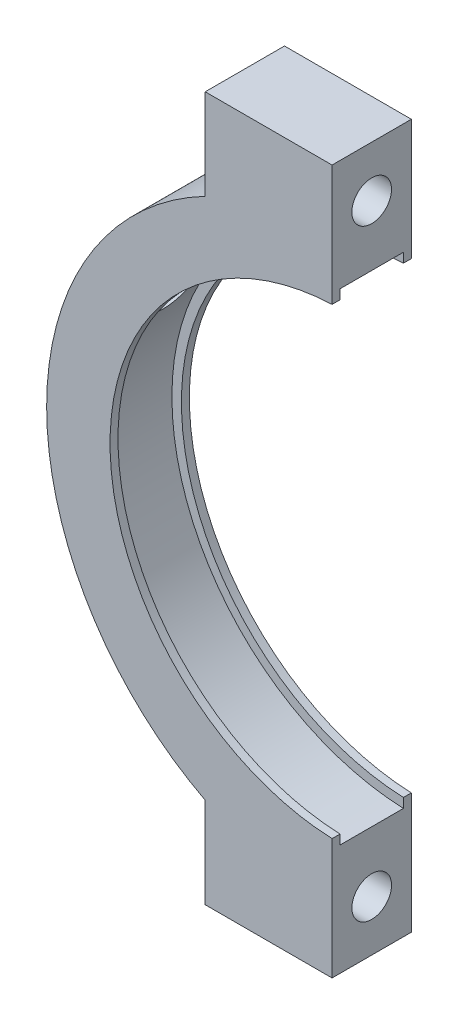
ISO-10303-21;
HEADER;
FILE_DESCRIPTION(('STEP AP214'),'2;1');
FILE_NAME('part.step','',(''),(''),'','','');
FILE_SCHEMA(('AUTOMOTIVE_DESIGN { 1 0 10303 214 1 1 1 1 }'));
ENDSEC;
DATA;
#1=APPLICATION_CONTEXT('core data for automotive mechanical design processes');
#2=APPLICATION_PROTOCOL_DEFINITION('international standard','automotive_design',2000,#1);
#3=PRODUCT_CONTEXT('',#1,'mechanical');
#4=PRODUCT('Part','Part','',(#3));
#5=PRODUCT_RELATED_PRODUCT_CATEGORY('part','',(#4));
#6=PRODUCT_DEFINITION_FORMATION('','',#4);
#7=PRODUCT_DEFINITION_CONTEXT('part definition',#1,'design');
#8=PRODUCT_DEFINITION('design','',#6,#7);
#9=PRODUCT_DEFINITION_SHAPE('','',#8);
#10=(LENGTH_UNIT() NAMED_UNIT(*) SI_UNIT(.MILLI.,.METRE.));
#11=(NAMED_UNIT(*) PLANE_ANGLE_UNIT() SI_UNIT($,.RADIAN.));
#12=(NAMED_UNIT(*) SI_UNIT($,.STERADIAN.) SOLID_ANGLE_UNIT());
#13=UNCERTAINTY_MEASURE_WITH_UNIT(LENGTH_MEASURE(1.E-05),#10,'distance_accuracy_value','');
#14=(GEOMETRIC_REPRESENTATION_CONTEXT(3) GLOBAL_UNCERTAINTY_ASSIGNED_CONTEXT((#13)) GLOBAL_UNIT_ASSIGNED_CONTEXT((#10,
#11,#12)) REPRESENTATION_CONTEXT('',''));
#15=CARTESIAN_POINT('',(0.,0.,0.));
#16=DIRECTION('',(0.,0.,1.));
#17=DIRECTION('',(1.,0.,0.));
#18=AXIS2_PLACEMENT_3D('',#15,#16,#17);
#19=CARTESIAN_POINT('',(0.,0.,12.5));
#20=DIRECTION('',(0.,0.,-1.));
#21=DIRECTION('',(-1.,0.,0.));
#22=AXIS2_PLACEMENT_3D('',#19,#20,#21);
#23=CYLINDRICAL_SURFACE('',#22,76.);
#24=CARTESIAN_POINT('',(-68.5692997524356,32.7757704937754,0.));
#25=CARTESIAN_POINT('',(-68.5693002058538,32.7757690854834,-0.165493667479842));
#26=CARTESIAN_POINT('',(-68.5662873724525,32.7820747233003,-0.33096462819236));
#27=CARTESIAN_POINT('',(-68.5542474318624,32.807245558167,-0.660781878736066));
#28=CARTESIAN_POINT('',(-68.5452188265017,32.8261138838363,-0.825127878103317));
#29=CARTESIAN_POINT('',(-68.5211708228262,32.8762820275246,-1.15160530625675));
#30=CARTESIAN_POINT('',(-68.5061464250846,32.9075922197597,-1.31373476987005));
#31=CARTESIAN_POINT('',(-68.4701602448416,32.9824025523511,-1.63454844029392));
#32=CARTESIAN_POINT('',(-68.4491962906626,33.0259071512813,-1.79323136405701));
#33=CARTESIAN_POINT('',(-68.4014400412515,33.1247038478475,-2.10581793104487));
#34=CARTESIAN_POINT('',(-68.374653157051,33.179985001023,-2.25972586076757));
#35=CARTESIAN_POINT('',(-68.3153388232892,33.3019380488995,-2.56188426429269));
#36=CARTESIAN_POINT('',(-68.2828092602809,33.3686141369272,-2.71013263072218));
#37=CARTESIAN_POINT('',(-68.2121740578346,33.5127698873989,-2.99978046034227));
#38=CARTESIAN_POINT('',(-68.1740717203821,33.5902431510185,-3.14118391370381));
#39=CARTESIAN_POINT('',(-68.0924263358897,33.7554434776051,-3.4162923144143));
#40=CARTESIAN_POINT('',(-68.0488812814241,33.8431743230794,-3.54999439456419));
#41=CARTESIAN_POINT('',(-67.9564813123334,34.0283318172424,-3.80891378375593));
#42=CARTESIAN_POINT('',(-67.9076179041945,34.1257739534888,-3.93411698653914));
#43=CARTESIAN_POINT('',(-67.8048475626829,34.3295159582644,-4.17496251412808));
#44=CARTESIAN_POINT('',(-67.7509387724542,34.4358190863248,-4.29060128920192));
#45=CARTESIAN_POINT('',(-67.6383727016015,34.6563971082992,-4.51141380456402));
#46=CARTESIAN_POINT('',(-67.5797169718978,34.7706693968552,-4.6165909380457));
#47=CARTESIAN_POINT('',(-67.4579163135299,35.0063869803777,-4.81581567689755));
#48=CARTESIAN_POINT('',(-67.3947697360081,35.1278349071503,-4.90985916031907));
#49=CARTESIAN_POINT('',(-67.2642827543562,35.3770555785603,-5.08618154838043));
#50=CARTESIAN_POINT('',(-67.1969386860885,35.5048338286223,-5.16844996169271));
#51=CARTESIAN_POINT('',(-67.058457995789,35.7656962788402,-5.32056306629331));
#52=CARTESIAN_POINT('',(-66.9873199800277,35.8987824242925,-5.39040315052959));
#53=CARTESIAN_POINT('',(-66.841708168528,36.1691801170528,-5.51709643666651));
#54=CARTESIAN_POINT('',(-66.7672356566567,36.3064900318346,-5.5739545863827));
#55=CARTESIAN_POINT('',(-66.615385399669,36.5843626193006,-5.67432455388897));
#56=CARTESIAN_POINT('',(-66.5380065947611,36.724926471235,-5.71783144900137));
#57=CARTESIAN_POINT('',(-66.3026078390417,37.1492676817676,-5.82759802324825));
#58=CARTESIAN_POINT('',(-66.1408676891957,37.436546798973,-5.87350147852735));
#59=CARTESIAN_POINT('',(-65.8121788387295,38.0114055389987,-5.90930967715707));
#60=CARTESIAN_POINT('',(-65.6452302235067,38.2989851568175,-5.89921533816361));
#61=CARTESIAN_POINT('',(-65.3112014687383,38.8658578687487,-5.82347857635176));
#62=CARTESIAN_POINT('',(-65.1441223876118,39.1451674820666,-5.75795588502686));
#63=CARTESIAN_POINT('',(-64.8145978240686,39.6883979641118,-5.57338897383246));
#64=CARTESIAN_POINT('',(-64.6521523807803,39.9523187029079,-5.45434430214119));
#65=CARTESIAN_POINT('',(-64.3369297240062,40.457983485722,-5.16598374869025));
#66=CARTESIAN_POINT('',(-64.1841630765392,40.6997034189798,-4.99661403811585));
#67=CARTESIAN_POINT('',(-63.8936119101659,41.1543346885563,-4.6124488956435));
#68=CARTESIAN_POINT('',(-63.7558276544059,41.3672455188966,-4.39765266608273));
#69=CARTESIAN_POINT('',(-63.4997039829514,41.7593426990355,-3.92805670847477));
#70=CARTESIAN_POINT('',(-63.3814168204587,41.9384386039561,-3.67315294815839));
#71=CARTESIAN_POINT('',(-63.1690195289451,42.2576839901445,-3.13094073589916));
#72=CARTESIAN_POINT('',(-63.0749094162459,42.3978334451201,-2.84363226208045));
#73=CARTESIAN_POINT('',(-62.9143775580726,42.6356868143888,-2.24469503175817));
#74=CARTESIAN_POINT('',(-62.8479586098073,42.7333864406763,-1.93306382207886));
#75=CARTESIAN_POINT('',(-62.7453737755502,42.8838715188559,-1.29436078544765));
#76=CARTESIAN_POINT('',(-62.7092073385653,42.9366577887612,-0.967289239827253));
#77=CARTESIAN_POINT('',(-62.6685912872453,42.9959181741153,-0.307903042890027));
#78=CARTESIAN_POINT('',(-62.6640592027082,43.00251271076,0.0243957100584196));
#79=CARTESIAN_POINT('',(-62.6866705314482,42.9695441176282,0.685605959048097));
#80=CARTESIAN_POINT('',(-62.7138136888614,42.9299813606976,1.01451748242879));
#81=CARTESIAN_POINT('',(-62.7986636007554,42.8057640713446,1.65920081071759));
#82=CARTESIAN_POINT('',(-62.8563323037672,42.7211656771272,1.97498844774646));
#83=CARTESIAN_POINT('',(-63.0000005100945,42.5090137828762,2.5849498462903));
#84=CARTESIAN_POINT('',(-63.08600040875,42.3814596834282,2.87912330612595));
#85=CARTESIAN_POINT('',(-63.2833166769588,42.0862601800627,3.43817257365719));
#86=CARTESIAN_POINT('',(-63.3946849331412,41.9185325714007,3.70298665803465));
#87=CARTESIAN_POINT('',(-63.6385768920037,41.5473310504592,4.19517674506254));
#88=CARTESIAN_POINT('',(-63.7711009111098,41.3438566035109,4.4225521876411));
#89=CARTESIAN_POINT('',(-64.0529318964062,40.905864591287,4.83390626296211));
#90=CARTESIAN_POINT('',(-64.2022743626312,40.6712811693652,5.01779046135102));
#91=CARTESIAN_POINT('',(-64.5124178215415,40.1775160756981,5.33629311483774));
#92=CARTESIAN_POINT('',(-64.6732187127851,39.9183346217129,5.47091200601786));
#93=CARTESIAN_POINT('',(-65.0007997308949,39.3826675204967,5.68690632292662));
#94=CARTESIAN_POINT('',(-65.1675730383364,39.106201356096,5.76834055226198));
#95=CARTESIAN_POINT('',(-65.502177030343,38.5431155565696,5.87582223920589));
#96=CARTESIAN_POINT('',(-65.6700076977566,38.2564960857934,5.90187059291852));
#97=CARTESIAN_POINT('',(-65.9183998991286,37.8258145653503,5.89890576963857));
#98=CARTESIAN_POINT('',(-66.0005755607502,37.6822409154132,5.89093382381589));
#99=CARTESIAN_POINT('',(-66.1633663824283,37.3956682863583,5.86112528533816));
#100=CARTESIAN_POINT('',(-66.2439821090117,37.2526691141454,5.83929382731235));
#101=CARTESIAN_POINT('',(-66.4031408674464,36.968222594981,5.78190720587489));
#102=CARTESIAN_POINT('',(-66.4816831246207,36.8267758392503,5.74634698861476));
#103=CARTESIAN_POINT('',(-66.6361359385555,36.5465588803305,5.6617784536991));
#104=CARTESIAN_POINT('',(-66.7120474500252,36.4077877144438,5.61277507342708));
#105=CARTESIAN_POINT('',(-66.8608206345543,36.1338479968174,5.50164766509379));
#106=CARTESIAN_POINT('',(-66.9336813108022,35.9986806277204,5.43951938815141));
#107=CARTESIAN_POINT('',(-67.075868875599,35.7330449812473,5.30262152976062));
#108=CARTESIAN_POINT('',(-67.1451970492787,35.6025750000951,5.22785658890941));
#109=CARTESIAN_POINT('',(-67.2799786150256,35.3472111002194,5.06617339984334));
#110=CARTESIAN_POINT('',(-67.3454306632011,35.2223191190913,4.97925097121455));
#111=CARTESIAN_POINT('',(-67.4720564335756,34.9791422112201,4.79392223201629));
#112=CARTESIAN_POINT('',(-67.5332317093253,34.8608548884908,4.69552012650474));
#113=CARTESIAN_POINT('',(-67.6511832625119,34.6314033053599,4.48760182204019));
#114=CARTESIAN_POINT('',(-67.707946402383,34.5202604765047,4.37805451718884));
#115=CARTESIAN_POINT('',(-67.8165757528243,34.3063615138502,4.14889866933275));
#116=CARTESIAN_POINT('',(-67.868443750704,34.2036023208982,4.02929382892359));
#117=CARTESIAN_POINT('',(-67.9670894842171,34.007158639553,3.78075531824006));
#118=CARTESIAN_POINT('',(-68.0138640851957,33.913479743345,3.65181598354101));
#119=CARTESIAN_POINT('',(-68.1020556135324,33.7360317446918,3.38563242879528));
#120=CARTESIAN_POINT('',(-68.1434745116022,33.6522589981055,3.24839129096373));
#121=CARTESIAN_POINT('',(-68.2208710923037,33.4950808454558,2.96623927696069));
#122=CARTESIAN_POINT('',(-68.2568374305316,33.42169707475,2.82131323450793));
#123=CARTESIAN_POINT('',(-68.3230595900064,33.2861115375904,2.52513453866452));
#124=CARTESIAN_POINT('',(-68.3533174995768,33.2239056822997,2.37388422372653));
#125=CARTESIAN_POINT('',(-68.4079892967638,33.1111903329462,2.06620912366223));
#126=CARTESIAN_POINT('',(-68.4324081306382,33.0606709405184,1.90978884677084));
#127=CARTESIAN_POINT('',(-68.475328582494,32.9716819487474,1.59282030448826));
#128=CARTESIAN_POINT('',(-68.4938316944632,32.9332093071044,1.43227309241835));
#129=CARTESIAN_POINT('',(-68.5292832266452,32.8593898067337,1.06186392489873));
#130=CARTESIAN_POINT('',(-68.5442825164301,32.8280652127732,0.850998628493258));
#131=CARTESIAN_POINT('',(-68.5642904756897,32.7862564877782,0.426742971282811));
#132=CARTESIAN_POINT('',(-68.5692991678939,32.7757723093299,0.213352616223684));
#133=CARTESIAN_POINT('',(-68.5692997524356,32.7757704937754,0.));
#134=B_SPLINE_CURVE_WITH_KNOTS('',3,(#24,#25,#26,#27,#28,#29,#30,#31,#32,#33,#34,#35,#36,#37,
#38,#39,#40,#41,#42,#43,#44,#45,#46,#47,#48,#49,#50,#51,#52,#53,#54,#55,#56,#57,#58,#59,#60,#61,
#62,#63,#64,#65,#66,#67,#68,#69,#70,#71,#72,#73,#74,#75,#76,#77,#78,#79,#80,#81,#82,#83,#84,#85,
#86,#87,#88,#89,#90,#91,#92,#93,#94,#95,#96,#97,#98,#99,#100,#101,#102,#103,#104,#105,#106,#107,
#108,#109,#110,#111,#112,#113,#114,#115,#116,#117,#118,#119,#120,#121,#122,#123,#124,#125,#126,
#127,#128,#129,#130,#131,#132,#133),.UNSPECIFIED.,.T.,.F.,(4,2,2,2,2,2,2,2,2,2,2,2,2,2,2,2,2,2,
2,2,2,2,2,2,2,2,2,2,2,2,2,2,2,2,2,2,2,2,2,2,2,2,2,2,2,2,2,2,2,2,2,2,2,2,4),(0.,
0.496294512562512,0.992712668868089,1.48954561759398,1.98656045810053,2.483115400713,
2.97985347017489,3.47629839545591,3.97292696678587,4.47036063559986,4.96797810066379,
5.46543363547082,5.9630727682891,6.46115256275286,6.95941660733734,7.45749042994399,
7.95574767495123,8.94916404498434,9.94256413559565,10.933823833307,11.9250918991902,
12.917424088529,13.9097737040812,14.9047410821773,15.8997091319626,16.8947776635976,
17.889828071523,18.8822834283691,19.8747307684882,20.865943881602,21.8571708269206,
22.850443656758,23.8437313443361,24.8391563949528,25.8345726341405,26.8288864200178,
27.8231841184827,28.3195594809652,28.8157510550687,29.3121254622869,29.8083178054168,
30.3046710261448,30.8008423641727,31.2971847346051,31.7933458600907,32.2909318606319,
32.7883354744557,33.2860434981042,33.7835678582528,34.2821135486519,34.780476500126,
35.2784157828188,35.7762292137635,36.416048097383,37.0558655253554),.UNSPECIFIED.);
#135=CARTESIAN_POINT('',(-68.5692997524356,32.7757704937754,0.));
#136=VERTEX_POINT('',#135);
#137=EDGE_CURVE('E324',#136,#136,#134,.T.);
#138=ORIENTED_EDGE('',*,*,#137,.F.);
#139=EDGE_LOOP('',(#138));
#140=FACE_BOUND('',#139,.T.);
#141=DIRECTION('',(0.,0.,-1.));
#142=VECTOR('',#141,1.);
#143=CARTESIAN_POINT('',(-3.,-75.9407663906548,12.5));
#144=LINE('',#143,#142);
#145=CARTESIAN_POINT('',(-3.,-75.9407663906548,10.));
#146=VERTEX_POINT('',#145);
#147=CARTESIAN_POINT('',(-3.,-75.9407663906548,-10.));
#148=VERTEX_POINT('',#147);
#149=EDGE_CURVE('E257',#146,#148,#144,.T.);
#150=ORIENTED_EDGE('',*,*,#149,.T.);
#151=CARTESIAN_POINT('',(0.,0.,-10.));
#152=DIRECTION('',(0.,0.,1.));
#153=DIRECTION('',(1.,0.,0.));
#154=AXIS2_PLACEMENT_3D('',#151,#152,#153);
#155=CIRCLE('',#154,76.);
#156=CARTESIAN_POINT('',(-3.,75.9407663906548,-10.));
#157=VERTEX_POINT('',#156);
#158=EDGE_CURVE('E164',#157,#148,#155,.T.);
#159=ORIENTED_EDGE('',*,*,#158,.F.);
#160=DIRECTION('',(0.,0.,-1.));
#161=VECTOR('',#160,1.);
#162=CARTESIAN_POINT('',(-3.,75.9407663906548,12.5));
#163=LINE('',#162,#161);
#164=CARTESIAN_POINT('',(-3.,75.9407663906548,10.));
#165=VERTEX_POINT('',#164);
#166=EDGE_CURVE('E73',#165,#157,#163,.T.);
#167=ORIENTED_EDGE('',*,*,#166,.F.);
#168=CARTESIAN_POINT('',(0.,0.,10.));
#169=DIRECTION('',(0.,0.,1.));
#170=DIRECTION('',(1.,0.,0.));
#171=AXIS2_PLACEMENT_3D('',#168,#169,#170);
#172=CIRCLE('',#171,76.);
#173=EDGE_CURVE('E68',#165,#146,#172,.T.);
#174=ORIENTED_EDGE('',*,*,#173,.T.);
#175=EDGE_LOOP('',(#150,#159,#167,#174));
#176=FACE_BOUND('',#175,.T.);
#177=ADVANCED_FACE('F47',(#140,#176),#23,.F.);
#178=CARTESIAN_POINT('',(-3.,0.,12.5));
#179=DIRECTION('',(1.,0.,0.));
#180=DIRECTION('',(0.,0.,-1.));
#181=AXIS2_PLACEMENT_3D('',#178,#179,#180);
#182=PLANE('',#181);
#183=CARTESIAN_POINT('',(-3.,95.,0.));
#184=DIRECTION('',(1.,0.,0.));
#185=DIRECTION('',(0.,0.,-1.));
#186=AXIS2_PLACEMENT_3D('',#183,#184,#185);
#187=CIRCLE('',#186,6.24999999999999);
#188=CARTESIAN_POINT('',(-3.,95.,-6.24999999999999));
#189=VERTEX_POINT('',#188);
#190=EDGE_CURVE('E168',#189,#189,#187,.T.);
#191=ORIENTED_EDGE('',*,*,#190,.F.);
#192=EDGE_LOOP('',(#191));
#193=FACE_BOUND('',#192,.T.);
#194=DIRECTION('',(0.,-1.,0.));
#195=VECTOR('',#194,1.);
#196=CARTESIAN_POINT('',(-3.,0.,-12.5));
#197=LINE('',#196,#195);
#198=CARTESIAN_POINT('',(-3.,111.,-12.5));
#199=VERTEX_POINT('',#198);
#200=CARTESIAN_POINT('',(-3.,72.9383301152419,-12.5));
#201=VERTEX_POINT('',#200);
#202=EDGE_CURVE('E143',#199,#201,#197,.T.);
#203=ORIENTED_EDGE('',*,*,#202,.F.);
#204=DIRECTION('',(0.,0.,-1.));
#205=VECTOR('',#204,1.);
#206=CARTESIAN_POINT('',(-3.,111.,12.5));
#207=LINE('',#206,#205);
#208=CARTESIAN_POINT('',(-3.,111.,12.5));
#209=VERTEX_POINT('',#208);
#210=EDGE_CURVE('E61',#209,#199,#207,.T.);
#211=ORIENTED_EDGE('',*,*,#210,.F.);
#212=DIRECTION('',(0.,-1.,0.));
#213=VECTOR('',#212,1.);
#214=CARTESIAN_POINT('',(-3.,0.,12.5));
#215=LINE('',#214,#213);
#216=CARTESIAN_POINT('',(-3.,72.9383301152419,12.5));
#217=VERTEX_POINT('',#216);
#218=EDGE_CURVE('E212',#209,#217,#215,.T.);
#219=ORIENTED_EDGE('',*,*,#218,.T.);
#220=DIRECTION('',(0.,0.,-1.));
#221=VECTOR('',#220,1.);
#222=CARTESIAN_POINT('',(-3.,72.9383301152419,12.5));
#223=LINE('',#222,#221);
#224=CARTESIAN_POINT('',(-3.,72.9383301152419,10.));
#225=VERTEX_POINT('',#224);
#226=EDGE_CURVE('E194',#217,#225,#223,.T.);
#227=ORIENTED_EDGE('',*,*,#226,.T.);
#228=DIRECTION('',(0.,-1.,0.));
#229=VECTOR('',#228,1.);
#230=CARTESIAN_POINT('',(-3.,0.,10.));
#231=LINE('',#230,#229);
#232=EDGE_CURVE('E189',#165,#225,#231,.T.);
#233=ORIENTED_EDGE('',*,*,#232,.F.);
#234=ORIENTED_EDGE('',*,*,#166,.T.);
#235=DIRECTION('',(0.,-1.,0.));
#236=VECTOR('',#235,1.);
#237=CARTESIAN_POINT('',(-3.,0.,-10.));
#238=LINE('',#237,#236);
#239=CARTESIAN_POINT('',(-3.,72.9383301152419,-10.));
#240=VERTEX_POINT('',#239);
#241=EDGE_CURVE('E166',#157,#240,#238,.T.);
#242=ORIENTED_EDGE('',*,*,#241,.T.);
#243=DIRECTION('',(0.,0.,1.));
#244=VECTOR('',#243,1.);
#245=CARTESIAN_POINT('',(-3.,72.9383301152419,-12.5));
#246=LINE('',#245,#244);
#247=EDGE_CURVE('E160',#201,#240,#246,.T.);
#248=ORIENTED_EDGE('',*,*,#247,.F.);
#249=EDGE_LOOP('',(#203,#211,#219,#227,#233,#234,#242,#248));
#250=FACE_BOUND('',#249,.T.);
#251=ADVANCED_FACE('F49',(#193,#250),#182,.T.);
#252=CARTESIAN_POINT('',(0.,111.,12.5));
#253=DIRECTION('',(0.,-1.,0.));
#254=DIRECTION('',(1.,0.,0.));
#255=AXIS2_PLACEMENT_3D('',#252,#253,#254);
#256=PLANE('',#255);
#257=DIRECTION('',(-1.,0.,0.));
#258=VECTOR('',#257,1.);
#259=CARTESIAN_POINT('',(0.,111.,-12.5));
#260=LINE('',#259,#258);
#261=CARTESIAN_POINT('',(-43.,111.,-12.5));
#262=VERTEX_POINT('',#261);
#263=EDGE_CURVE('E150',#199,#262,#260,.T.);
#264=ORIENTED_EDGE('',*,*,#263,.T.);
#265=DIRECTION('',(0.,0.,-1.));
#266=VECTOR('',#265,1.);
#267=CARTESIAN_POINT('',(-43.,111.,12.5));
#268=LINE('',#267,#266);
#269=CARTESIAN_POINT('',(-43.,111.,12.5));
#270=VERTEX_POINT('',#269);
#271=EDGE_CURVE('E273',#270,#262,#268,.T.);
#272=ORIENTED_EDGE('',*,*,#271,.F.);
#273=DIRECTION('',(-1.,0.,0.));
#274=VECTOR('',#273,1.);
#275=CARTESIAN_POINT('',(0.,111.,12.5));
#276=LINE('',#275,#274);
#277=EDGE_CURVE('E215',#209,#270,#276,.T.);
#278=ORIENTED_EDGE('',*,*,#277,.F.);
#279=ORIENTED_EDGE('',*,*,#210,.T.);
#280=EDGE_LOOP('',(#264,#272,#278,#279));
#281=FACE_BOUND('',#280,.T.);
#282=ADVANCED_FACE('F279',(#281),#256,.F.);
#283=CARTESIAN_POINT('',(-43.,0.,12.5));
#284=DIRECTION('',(1.,0.,0.));
#285=DIRECTION('',(0.,0.,-1.));
#286=AXIS2_PLACEMENT_3D('',#283,#284,#285);
#287=PLANE('',#286);
#288=CARTESIAN_POINT('',(-43.,95.,0.));
#289=DIRECTION('',(1.,0.,0.));
#290=DIRECTION('',(0.,0.,-1.));
#291=AXIS2_PLACEMENT_3D('',#288,#289,#290);
#292=CIRCLE('',#291,6.24999999999999);
#293=CARTESIAN_POINT('',(-43.,95.,-6.24999999999999));
#294=VERTEX_POINT('',#293);
#295=EDGE_CURVE('E173',#294,#294,#292,.T.);
#296=ORIENTED_EDGE('',*,*,#295,.T.);
#297=EDGE_LOOP('',(#296));
#298=FACE_BOUND('',#297,.T.);
#299=DIRECTION('',(0.,-1.,0.));
#300=VECTOR('',#299,1.);
#301=CARTESIAN_POINT('',(-43.,0.,-12.5));
#302=LINE('',#301,#300);
#303=CARTESIAN_POINT('',(-43.,82.4621125123532,-12.5));
#304=VERTEX_POINT('',#303);
#305=EDGE_CURVE('E238',#262,#304,#302,.T.);
#306=ORIENTED_EDGE('',*,*,#305,.T.);
#307=DIRECTION('',(0.,0.,-1.));
#308=VECTOR('',#307,1.);
#309=CARTESIAN_POINT('',(-43.,82.4621125123532,12.5));
#310=LINE('',#309,#308);
#311=CARTESIAN_POINT('',(-43.,82.4621125123532,12.5));
#312=VERTEX_POINT('',#311);
#313=EDGE_CURVE('E269',#312,#304,#310,.T.);
#314=ORIENTED_EDGE('',*,*,#313,.F.);
#315=DIRECTION('',(0.,-1.,0.));
#316=VECTOR('',#315,1.);
#317=CARTESIAN_POINT('',(-43.,0.,12.5));
#318=LINE('',#317,#316);
#319=EDGE_CURVE('E219',#270,#312,#318,.T.);
#320=ORIENTED_EDGE('',*,*,#319,.F.);
#321=ORIENTED_EDGE('',*,*,#271,.T.);
#322=EDGE_LOOP('',(#306,#314,#320,#321));
#323=FACE_BOUND('',#322,.T.);
#324=ADVANCED_FACE('F351',(#298,#323),#287,.F.);
#325=CARTESIAN_POINT('',(0.,0.,12.5));
#326=DIRECTION('',(0.,0.,-1.));
#327=DIRECTION('',(-1.,0.,0.));
#328=AXIS2_PLACEMENT_3D('',#325,#326,#327);
#329=CYLINDRICAL_SURFACE('',#328,93.);
#330=CARTESIAN_POINT('',(-83.3281220233466,41.2967805048077,0.));
#331=CARTESIAN_POINT('',(-83.3281224954468,41.2967792081665,-0.165582999491883));
#332=CARTESIAN_POINT('',(-83.3250198809795,41.3030416498556,-0.331144352201314));
#333=CARTESIAN_POINT('',(-83.3126231239884,41.328041689012,-0.661143031826096));
#334=CARTESIAN_POINT('',(-83.3033274103559,41.3467824520663,-0.825580062818921));
#335=CARTESIAN_POINT('',(-83.2785742871126,41.3966162384014,-1.15224325234241));
#336=CARTESIAN_POINT('',(-83.2631116206172,41.4277198000035,-1.31446740222254));
#337=CARTESIAN_POINT('',(-83.2260893395178,41.5020454454027,-1.63546994681734));
#338=CARTESIAN_POINT('',(-83.2045274956226,41.545271960173,-1.79424705872528));
#339=CARTESIAN_POINT('',(-83.1554317622736,41.6434529712661,-2.10702389756651));
#340=CARTESIAN_POINT('',(-83.1279032569829,41.6983968933857,-2.26102778945159));
#341=CARTESIAN_POINT('',(-83.066981407856,41.8196269771669,-2.56337291450225));
#342=CARTESIAN_POINT('',(-83.0335859050555,41.8859173139013,-2.71171203857388));
#343=CARTESIAN_POINT('',(-82.9611189167678,42.029265884004,-3.00153118548023));
#344=CARTESIAN_POINT('',(-82.9220508443917,42.1063176413111,-3.14301526511286));
#345=CARTESIAN_POINT('',(-82.8383992631756,42.2706530327856,-3.41827216444137));
#346=CARTESIAN_POINT('',(-82.7938137209533,42.3579404385258,-3.55204211442368));
#347=CARTESIAN_POINT('',(-82.6993147817666,42.5421444753591,-3.81099920285444));
#348=CARTESIAN_POINT('',(-82.6493961307229,42.6390705957087,-3.93617767402902));
#349=CARTESIAN_POINT('',(-82.5445051605463,42.8417750726106,-4.17696543279033));
#350=CARTESIAN_POINT('',(-82.489530981342,42.9475566860543,-4.29257116832741));
#351=CARTESIAN_POINT('',(-82.3748550589865,43.167100693817,-4.51330743465567));
#352=CARTESIAN_POINT('',(-82.3151548671142,43.2808604679759,-4.61844137735787));
#353=CARTESIAN_POINT('',(-82.191315208861,43.5155755368708,-4.8175689077757));
#354=CARTESIAN_POINT('',(-82.1271741119841,43.6365334721257,-4.91155836902627));
#355=CARTESIAN_POINT('',(-81.9948042257864,43.8847566605901,-5.08772451854215));
#356=CARTESIAN_POINT('',(-81.9265735666443,44.0120247942697,-5.1698957440199));
#357=CARTESIAN_POINT('',(-81.7864275522505,44.2719106903458,-5.32181561717731));
#358=CARTESIAN_POINT('',(-81.7145108441689,44.4045304129946,-5.3915596612617));
#359=CARTESIAN_POINT('',(-81.567472474476,44.674052442689,-5.51806476891716));
#360=CARTESIAN_POINT('',(-81.4923520352811,44.8109531110699,-5.57483073274018));
#361=CARTESIAN_POINT('',(-81.3393546395267,45.0880752565064,-5.67502263187747));
#362=CARTESIAN_POINT('',(-81.2614766771816,45.2282979389401,-5.71844364264299));
#363=CARTESIAN_POINT('',(-81.0247221962972,45.6519260392957,-5.82801587682083));
#364=CARTESIAN_POINT('',(-80.8623629874772,45.9389564242014,-5.87378738928908));
#365=CARTESIAN_POINT('',(-80.5331392428974,46.5136901566336,-5.90930731202029));
#366=CARTESIAN_POINT('',(-80.3662747592319,46.8013934963437,-5.8990563697901));
#367=CARTESIAN_POINT('',(-80.0329761777907,47.3690917908238,-5.82295633681517));
#368=CARTESIAN_POINT('',(-79.8665418062271,47.6490972432371,-5.75718728136567));
#369=CARTESIAN_POINT('',(-79.538907196688,48.1940184625522,-5.57202275398816));
#370=CARTESIAN_POINT('',(-79.3777069904101,48.458934138079,-5.45262695736645));
#371=CARTESIAN_POINT('',(-79.0654942938466,48.9666886055212,-5.16351275916141));
#372=CARTESIAN_POINT('',(-78.9144892414984,49.2095113233317,-4.9937580947149));
#373=CARTESIAN_POINT('',(-78.6277339859657,49.6664104200506,-4.60876986479097));
#374=CARTESIAN_POINT('',(-78.4919839598572,49.8804864652814,-4.3935357714846));
#375=CARTESIAN_POINT('',(-78.2401060768625,50.2746529602614,-3.9232466518615));
#376=CARTESIAN_POINT('',(-78.1240132125872,50.4546828681308,-3.6681221353233));
#377=CARTESIAN_POINT('',(-77.9157997328775,50.7756326309928,-3.12553753196288));
#378=CARTESIAN_POINT('',(-77.8236791272946,50.9165524699128,-2.8380774318521));
#379=CARTESIAN_POINT('',(-77.666709841267,51.1556716579948,-2.23893700308945));
#380=CARTESIAN_POINT('',(-77.6018627616223,51.2538684995729,-1.92725525403703));
#381=CARTESIAN_POINT('',(-77.5018255899325,51.4050125575843,-1.28853952507752));
#382=CARTESIAN_POINT('',(-77.4666351383689,51.4579603225588,-0.961505731329407));
#383=CARTESIAN_POINT('',(-77.4272522204334,51.5172000744424,-0.301979252063783));
#384=CARTESIAN_POINT('',(-77.4230058498539,51.5235731938654,0.0305029289868067));
#385=CARTESIAN_POINT('',(-77.4455266613001,51.4897154538776,0.692024467436748));
#386=CARTESIAN_POINT('',(-77.4722936769845,51.4494848444277,1.02106384329216));
#387=CARTESIAN_POINT('',(-77.5558123866481,51.3234995942295,1.66608447322892));
#388=CARTESIAN_POINT('',(-77.6125393974152,51.2377824283219,1.98207624614624));
#389=CARTESIAN_POINT('',(-77.7538855748802,51.0230311390823,2.59235652298271));
#390=CARTESIAN_POINT('',(-77.8385050021999,50.8939966110004,2.88664482407702));
#391=CARTESIAN_POINT('',(-78.0327308838936,50.5956965754165,3.44561090437559));
#392=CARTESIAN_POINT('',(-78.1423717101021,50.4263757129244,3.71024719807445));
#393=CARTESIAN_POINT('',(-78.3827235994313,50.0519529874698,4.20197911793318));
#394=CARTESIAN_POINT('',(-78.51343487493,49.8468507638502,4.4290743656544));
#395=CARTESIAN_POINT('',(-78.7916624621046,49.4058890047969,4.83960675939832));
#396=CARTESIAN_POINT('',(-78.9392025461886,49.1699858902173,5.02298098703337));
#397=CARTESIAN_POINT('',(-79.2460509223408,48.6738978488096,5.34043367344279));
#398=CARTESIAN_POINT('',(-79.4053591400311,48.4137130754457,5.47451244374627));
#399=CARTESIAN_POINT('',(-79.7304964883782,47.8763666495637,5.68946533941934));
#400=CARTESIAN_POINT('',(-79.8963206446388,47.5992178609022,5.77037924659511));
#401=CARTESIAN_POINT('',(-80.2296291848121,47.035237762972,5.87681147754249));
#402=CARTESIAN_POINT('',(-80.3971135517856,46.7484065524222,5.90233036593019));
#403=CARTESIAN_POINT('',(-80.6455463271333,46.3176380321253,5.8985800810284));
#404=CARTESIAN_POINT('',(-80.7278639790024,46.1740107282468,5.89033520194376));
#405=CARTESIAN_POINT('',(-80.8910952637143,45.8874470777769,5.85996064536852));
#406=CARTESIAN_POINT('',(-80.9720094045734,45.7445104952815,5.83783610429871));
#407=CARTESIAN_POINT('',(-81.1319146330355,45.4603019415558,5.77984427102896));
#408=CARTESIAN_POINT('',(-81.2109049991567,45.3190306047952,5.74397190482824));
#409=CARTESIAN_POINT('',(-81.366391057158,45.0392717643041,5.65876123615139));
#410=CARTESIAN_POINT('',(-81.4428876552179,44.9007832565338,5.60942788755693));
#411=CARTESIAN_POINT('',(-81.5929542350121,44.6275042237402,5.49762175360835));
#412=CARTESIAN_POINT('',(-81.6665231615689,44.4927150373442,5.43514428101066));
#413=CARTESIAN_POINT('',(-81.8102264933873,44.2279269928654,5.29753212086429));
#414=CARTESIAN_POINT('',(-81.8803621502362,44.0979263934616,5.22240209078728));
#415=CARTESIAN_POINT('',(-82.0168339640682,43.8435831792687,5.05997532976213));
#416=CARTESIAN_POINT('',(-82.0831688216093,43.7192425024821,4.97267447238145));
#417=CARTESIAN_POINT('',(-82.2116083124334,43.4772379682114,4.78657896511154));
#418=CARTESIAN_POINT('',(-82.2737144870832,43.3595716805324,4.68778853914673));
#419=CARTESIAN_POINT('',(-82.3934988139221,43.1315195587612,4.47917666054293));
#420=CARTESIAN_POINT('',(-82.4511678099142,43.0211488419804,4.36933342339547));
#421=CARTESIAN_POINT('',(-82.5616073118438,42.808822884781,4.13960249688225));
#422=CARTESIAN_POINT('',(-82.6143796094462,42.706864567854,4.01971851214137));
#423=CARTESIAN_POINT('',(-82.7148043899153,42.5120354375154,3.77064205251425));
#424=CARTESIAN_POINT('',(-82.7624537100701,42.4191702409373,3.64144390873507));
#425=CARTESIAN_POINT('',(-82.8523359654277,42.243344727266,3.37476785358109));
#426=CARTESIAN_POINT('',(-82.894570892195,42.1603807690019,3.23729301410851));
#427=CARTESIAN_POINT('',(-82.9734999388127,42.0048322280124,2.95476109429761));
#428=CARTESIAN_POINT('',(-83.0101848744867,41.9322648599538,2.80969196935804));
#429=CARTESIAN_POINT('',(-83.0777397023922,41.7982630838395,2.51326475911896));
#430=CARTESIAN_POINT('',(-83.1086117194384,41.7368246081176,2.36190899658388));
#431=CARTESIAN_POINT('',(-83.1643859098531,41.6255785444095,2.05406418733497));
#432=CARTESIAN_POINT('',(-83.1892932165975,41.575760956167,1.89757968737617));
#433=CARTESIAN_POINT('',(-83.2330488346158,41.488094397372,1.58052149907429));
#434=CARTESIAN_POINT('',(-83.2518986963813,41.4502423641011,1.41994886852298));
#435=CARTESIAN_POINT('',(-83.2877752529157,41.3781169667952,1.05148375328495));
#436=CARTESIAN_POINT('',(-83.3028971332287,41.3476461135406,0.84264769196907));
#437=CARTESIAN_POINT('',(-83.3230702100524,41.3069787242439,0.422529340596391));
#438=CARTESIAN_POINT('',(-83.3281214210517,41.2967821590333,0.211247054059412));
#439=CARTESIAN_POINT('',(-83.3281220233466,41.2967805048077,0.));
#440=B_SPLINE_CURVE_WITH_KNOTS('',3,(#330,#331,#332,#333,#334,#335,#336,#337,#338,#339,#340,
#341,#342,#343,#344,#345,#346,#347,#348,#349,#350,#351,#352,#353,#354,#355,#356,#357,#358,#359,
#360,#361,#362,#363,#364,#365,#366,#367,#368,#369,#370,#371,#372,#373,#374,#375,#376,#377,#378,
#379,#380,#381,#382,#383,#384,#385,#386,#387,#388,#389,#390,#391,#392,#393,#394,#395,#396,#397,
#398,#399,#400,#401,#402,#403,#404,#405,#406,#407,#408,#409,#410,#411,#412,#413,#414,#415,#416,
#417,#418,#419,#420,#421,#422,#423,#424,#425,#426,#427,#428,#429,#430,#431,#432,#433,#434,#435,
#436,#437,#438,#439),.UNSPECIFIED.,.T.,.F.,(4,2,2,2,2,2,2,2,2,2,2,2,2,2,2,2,2,2,2,2,2,2,2,2,2,2,
2,2,2,2,2,2,2,2,2,2,2,2,2,2,2,2,2,2,2,2,2,2,2,2,2,2,2,2,4),(0.,0.496564394076836,
0.993254808073489,1.49036952303592,1.98766617214303,2.48451592797229,2.98154890124478,
3.47828404609401,3.97520280361103,4.47261571118943,4.97021236885426,5.46764636596988,
5.96526397648891,6.46311086847507,6.96114180397809,7.4589843816939,7.95701045308552,
8.95063804969353,9.94425416199005,10.9364403118633,11.9286324692049,12.9215408346001,
13.9144607242073,14.9091299852,15.9037996549616,16.8985276980002,17.8932436820761,
18.8862264680293,19.879203928109,20.8713645747418,21.8635344922105,22.8570756438099,
23.8506268103529,24.8455992689108,25.8405654395013,26.8347862538071,27.8289969344273,
28.3257629891431,28.8223453149226,29.3191110944038,29.8156943012208,30.3124548925345,
30.8090330218128,31.3057799236864,31.8023447797248,32.2999082573072,32.7972889562999,
33.2949749751475,33.7924774027479,34.2907943027713,34.7889286963124,35.2866328299902,
35.7842094673515,36.4177160268292,37.0512216748814),.UNSPECIFIED.);
#441=CARTESIAN_POINT('',(-83.3281220233466,41.2967805048077,0.));
#442=VERTEX_POINT('',#441);
#443=EDGE_CURVE('E11',#442,#442,#440,.T.);
#444=ORIENTED_EDGE('',*,*,#443,.T.);
#445=EDGE_LOOP('',(#444));
#446=FACE_BOUND('',#445,.T.);
#447=CARTESIAN_POINT('',(0.,0.,-12.5));
#448=DIRECTION('',(0.,0.,1.));
#449=DIRECTION('',(1.,0.,0.));
#450=AXIS2_PLACEMENT_3D('',#447,#448,#449);
#451=CIRCLE('',#450,93.);
#452=CARTESIAN_POINT('',(-43.,-82.4621125123532,-12.5));
#453=VERTEX_POINT('',#452);
#454=EDGE_CURVE('E241',#304,#453,#451,.T.);
#455=ORIENTED_EDGE('',*,*,#454,.T.);
#456=DIRECTION('',(0.,0.,-1.));
#457=VECTOR('',#456,1.);
#458=CARTESIAN_POINT('',(-43.,-82.4621125123532,12.5));
#459=LINE('',#458,#457);
#460=CARTESIAN_POINT('',(-43.,-82.4621125123532,12.5));
#461=VERTEX_POINT('',#460);
#462=EDGE_CURVE('E266',#461,#453,#459,.T.);
#463=ORIENTED_EDGE('',*,*,#462,.F.);
#464=CARTESIAN_POINT('',(0.,0.,12.5));
#465=DIRECTION('',(0.,0.,1.));
#466=DIRECTION('',(1.,0.,0.));
#467=AXIS2_PLACEMENT_3D('',#464,#465,#466);
#468=CIRCLE('',#467,93.);
#469=EDGE_CURVE('E222',#312,#461,#468,.T.);
#470=ORIENTED_EDGE('',*,*,#469,.F.);
#471=ORIENTED_EDGE('',*,*,#313,.T.);
#472=EDGE_LOOP('',(#455,#463,#470,#471));
#473=FACE_BOUND('',#472,.T.);
#474=ADVANCED_FACE('F354',(#446,#473),#329,.T.);
#475=CARTESIAN_POINT('',(-43.,0.,12.5));
#476=DIRECTION('',(-1.,0.,0.));
#477=DIRECTION('',(0.,0.,1.));
#478=AXIS2_PLACEMENT_3D('',#475,#476,#477);
#479=PLANE('',#478);
#480=CARTESIAN_POINT('',(-43.,-95.,0.));
#481=DIRECTION('',(-1.,0.,0.));
#482=DIRECTION('',(0.,0.,1.));
#483=AXIS2_PLACEMENT_3D('',#480,#481,#482);
#484=CIRCLE('',#483,6.24999999999999);
#485=CARTESIAN_POINT('',(-43.,-95.,6.24999999999998));
#486=VERTEX_POINT('',#485);
#487=EDGE_CURVE('E185',#486,#486,#484,.T.);
#488=ORIENTED_EDGE('',*,*,#487,.F.);
#489=EDGE_LOOP('',(#488));
#490=FACE_BOUND('',#489,.T.);
#491=DIRECTION('',(0.,1.,0.));
#492=VECTOR('',#491,1.);
#493=CARTESIAN_POINT('',(-43.,0.,-12.5));
#494=LINE('',#493,#492);
#495=CARTESIAN_POINT('',(-43.,-111.,-12.5));
#496=VERTEX_POINT('',#495);
#497=EDGE_CURVE('E245',#496,#453,#494,.T.);
#498=ORIENTED_EDGE('',*,*,#497,.F.);
#499=DIRECTION('',(0.,0.,-1.));
#500=VECTOR('',#499,1.);
#501=CARTESIAN_POINT('',(-43.,-111.,12.5));
#502=LINE('',#501,#500);
#503=CARTESIAN_POINT('',(-43.,-111.,12.5));
#504=VERTEX_POINT('',#503);
#505=EDGE_CURVE('E263',#504,#496,#502,.T.);
#506=ORIENTED_EDGE('',*,*,#505,.F.);
#507=DIRECTION('',(0.,1.,0.));
#508=VECTOR('',#507,1.);
#509=CARTESIAN_POINT('',(-43.,0.,12.5));
#510=LINE('',#509,#508);
#511=EDGE_CURVE('E225',#504,#461,#510,.T.);
#512=ORIENTED_EDGE('',*,*,#511,.T.);
#513=ORIENTED_EDGE('',*,*,#462,.T.);
#514=EDGE_LOOP('',(#498,#506,#512,#513));
#515=FACE_BOUND('',#514,.T.);
#516=ADVANCED_FACE('F365',(#490,#515),#479,.T.);
#517=CARTESIAN_POINT('',(0.,-111.,12.5));
#518=DIRECTION('',(0.,-1.,0.));
#519=DIRECTION('',(1.,0.,0.));
#520=AXIS2_PLACEMENT_3D('',#517,#518,#519);
#521=PLANE('',#520);
#522=DIRECTION('',(-1.,0.,0.));
#523=VECTOR('',#522,1.);
#524=CARTESIAN_POINT('',(0.,-111.,-12.5));
#525=LINE('',#524,#523);
#526=CARTESIAN_POINT('',(-3.,-111.,-12.5));
#527=VERTEX_POINT('',#526);
#528=EDGE_CURVE('E249',#527,#496,#525,.T.);
#529=ORIENTED_EDGE('',*,*,#528,.F.);
#530=DIRECTION('',(0.,0.,-1.));
#531=VECTOR('',#530,1.);
#532=CARTESIAN_POINT('',(-3.,-111.,12.5));
#533=LINE('',#532,#531);
#534=CARTESIAN_POINT('',(-3.,-111.,12.5));
#535=VERTEX_POINT('',#534);
#536=EDGE_CURVE('E260',#535,#527,#533,.T.);
#537=ORIENTED_EDGE('',*,*,#536,.F.);
#538=DIRECTION('',(-1.,0.,0.));
#539=VECTOR('',#538,1.);
#540=CARTESIAN_POINT('',(0.,-111.,12.5));
#541=LINE('',#540,#539);
#542=EDGE_CURVE('E229',#535,#504,#541,.T.);
#543=ORIENTED_EDGE('',*,*,#542,.T.);
#544=ORIENTED_EDGE('',*,*,#505,.T.);
#545=EDGE_LOOP('',(#529,#537,#543,#544));
#546=FACE_BOUND('',#545,.T.);
#547=ADVANCED_FACE('F367',(#546),#521,.T.);
#548=CARTESIAN_POINT('',(-3.,0.,12.5));
#549=DIRECTION('',(-1.,0.,0.));
#550=DIRECTION('',(0.,0.,1.));
#551=AXIS2_PLACEMENT_3D('',#548,#549,#550);
#552=PLANE('',#551);
#553=CARTESIAN_POINT('',(-3.,-95.,0.));
#554=DIRECTION('',(1.,0.,0.));
#555=DIRECTION('',(0.,0.,-1.));
#556=AXIS2_PLACEMENT_3D('',#553,#554,#555);
#557=CIRCLE('',#556,6.24999999999999);
#558=CARTESIAN_POINT('',(-3.,-95.,-6.25));
#559=VERTEX_POINT('',#558);
#560=EDGE_CURVE('E181',#559,#559,#557,.T.);
#561=ORIENTED_EDGE('',*,*,#560,.F.);
#562=EDGE_LOOP('',(#561));
#563=FACE_BOUND('',#562,.T.);
#564=DIRECTION('',(0.,1.,0.));
#565=VECTOR('',#564,1.);
#566=CARTESIAN_POINT('',(-3.,0.,-12.5));
#567=LINE('',#566,#565);
#568=CARTESIAN_POINT('',(-3.,-72.9383301152419,-12.5));
#569=VERTEX_POINT('',#568);
#570=EDGE_CURVE('E216',#527,#569,#567,.T.);
#571=ORIENTED_EDGE('',*,*,#570,.T.);
#572=DIRECTION('',(0.,0.,1.));
#573=VECTOR('',#572,1.);
#574=CARTESIAN_POINT('',(-3.,-72.9383301152419,-12.5));
#575=LINE('',#574,#573);
#576=CARTESIAN_POINT('',(-3.,-72.9383301152419,-10.));
#577=VERTEX_POINT('',#576);
#578=EDGE_CURVE('E162',#569,#577,#575,.T.);
#579=ORIENTED_EDGE('',*,*,#578,.T.);
#580=DIRECTION('',(0.,1.,0.));
#581=VECTOR('',#580,1.);
#582=CARTESIAN_POINT('',(-3.,0.,-10.));
#583=LINE('',#582,#581);
#584=EDGE_CURVE('E369',#148,#577,#583,.T.);
#585=ORIENTED_EDGE('',*,*,#584,.F.);
#586=ORIENTED_EDGE('',*,*,#149,.F.);
#587=DIRECTION('',(0.,1.,0.));
#588=VECTOR('',#587,1.);
#589=CARTESIAN_POINT('',(-3.,0.,10.));
#590=LINE('',#589,#588);
#591=CARTESIAN_POINT('',(-3.,-72.9383301152419,10.));
#592=VERTEX_POINT('',#591);
#593=EDGE_CURVE('E201',#146,#592,#590,.T.);
#594=ORIENTED_EDGE('',*,*,#593,.T.);
#595=DIRECTION('',(0.,0.,-1.));
#596=VECTOR('',#595,1.);
#597=CARTESIAN_POINT('',(-3.,-72.9383301152419,12.5));
#598=LINE('',#597,#596);
#599=CARTESIAN_POINT('',(-3.,-72.9383301152419,12.5));
#600=VERTEX_POINT('',#599);
#601=EDGE_CURVE('E154',#600,#592,#598,.T.);
#602=ORIENTED_EDGE('',*,*,#601,.F.);
#603=DIRECTION('',(0.,1.,0.));
#604=VECTOR('',#603,1.);
#605=CARTESIAN_POINT('',(-3.,0.,12.5));
#606=LINE('',#605,#604);
#607=EDGE_CURVE('E233',#535,#600,#606,.T.);
#608=ORIENTED_EDGE('',*,*,#607,.F.);
#609=ORIENTED_EDGE('',*,*,#536,.T.);
#610=EDGE_LOOP('',(#571,#579,#585,#586,#594,#602,#608,#609));
#611=FACE_BOUND('',#610,.T.);
#612=ADVANCED_FACE('F295',(#563,#611),#552,.F.);
#613=CARTESIAN_POINT('',(0.,0.,12.5));
#614=DIRECTION('',(0.,0.,1.));
#615=DIRECTION('',(1.,0.,0.));
#616=AXIS2_PLACEMENT_3D('',#613,#614,#615);
#617=PLANE('',#616);
#618=ORIENTED_EDGE('',*,*,#218,.F.);
#619=ORIENTED_EDGE('',*,*,#277,.T.);
#620=ORIENTED_EDGE('',*,*,#319,.T.);
#621=ORIENTED_EDGE('',*,*,#469,.T.);
#622=ORIENTED_EDGE('',*,*,#511,.F.);
#623=ORIENTED_EDGE('',*,*,#542,.F.);
#624=ORIENTED_EDGE('',*,*,#607,.T.);
#625=CARTESIAN_POINT('',(0.,0.,12.5));
#626=DIRECTION('',(0.,0.,1.));
#627=DIRECTION('',(1.,0.,0.));
#628=AXIS2_PLACEMENT_3D('',#625,#626,#627);
#629=CIRCLE('',#628,73.);
#630=EDGE_CURVE('E190',#217,#600,#629,.T.);
#631=ORIENTED_EDGE('',*,*,#630,.F.);
#632=EDGE_LOOP('',(#618,#619,#620,#621,#622,#623,#624,#631));
#633=FACE_BOUND('',#632,.T.);
#634=ADVANCED_FACE('F289',(#633),#617,.T.);
#635=CARTESIAN_POINT('',(0.,0.,-12.5));
#636=DIRECTION('',(0.,0.,1.));
#637=DIRECTION('',(1.,0.,0.));
#638=AXIS2_PLACEMENT_3D('',#635,#636,#637);
#639=PLANE('',#638);
#640=ORIENTED_EDGE('',*,*,#202,.T.);
#641=CARTESIAN_POINT('',(0.,0.,-12.5));
#642=DIRECTION('',(0.,0.,1.));
#643=DIRECTION('',(1.,0.,0.));
#644=AXIS2_PLACEMENT_3D('',#641,#642,#643);
#645=CIRCLE('',#644,73.);
#646=EDGE_CURVE('E147',#201,#569,#645,.T.);
#647=ORIENTED_EDGE('',*,*,#646,.T.);
#648=ORIENTED_EDGE('',*,*,#570,.F.);
#649=ORIENTED_EDGE('',*,*,#528,.T.);
#650=ORIENTED_EDGE('',*,*,#497,.T.);
#651=ORIENTED_EDGE('',*,*,#454,.F.);
#652=ORIENTED_EDGE('',*,*,#305,.F.);
#653=ORIENTED_EDGE('',*,*,#263,.F.);
#654=EDGE_LOOP('',(#640,#647,#648,#649,#650,#651,#652,#653));
#655=FACE_BOUND('',#654,.T.);
#656=ADVANCED_FACE('F145',(#655),#639,.F.);
#657=CARTESIAN_POINT('',(0.,0.,12.5));
#658=DIRECTION('',(0.,0.,-1.));
#659=DIRECTION('',(-1.,0.,0.));
#660=AXIS2_PLACEMENT_3D('',#657,#658,#659);
#661=CYLINDRICAL_SURFACE('',#660,73.);
#662=CARTESIAN_POINT('',(0.,0.,10.));
#663=DIRECTION('',(0.,0.,1.));
#664=DIRECTION('',(1.,0.,0.));
#665=AXIS2_PLACEMENT_3D('',#662,#663,#664);
#666=CIRCLE('',#665,73.);
#667=EDGE_CURVE('E195',#225,#592,#666,.T.);
#668=ORIENTED_EDGE('',*,*,#667,.F.);
#669=ORIENTED_EDGE('',*,*,#226,.F.);
#670=ORIENTED_EDGE('',*,*,#630,.T.);
#671=ORIENTED_EDGE('',*,*,#601,.T.);
#672=EDGE_LOOP('',(#668,#669,#670,#671));
#673=FACE_BOUND('',#672,.T.);
#674=ADVANCED_FACE('F288',(#673),#661,.F.);
#675=CARTESIAN_POINT('',(0.,0.,10.));
#676=DIRECTION('',(0.,0.,1.));
#677=DIRECTION('',(1.,0.,0.));
#678=AXIS2_PLACEMENT_3D('',#675,#676,#677);
#679=PLANE('',#678);
#680=ORIENTED_EDGE('',*,*,#232,.T.);
#681=ORIENTED_EDGE('',*,*,#667,.T.);
#682=ORIENTED_EDGE('',*,*,#593,.F.);
#683=ORIENTED_EDGE('',*,*,#173,.F.);
#684=EDGE_LOOP('',(#680,#681,#682,#683));
#685=FACE_BOUND('',#684,.T.);
#686=ADVANCED_FACE('F298',(#685),#679,.F.);
#687=CARTESIAN_POINT('',(-3.,-95.,0.));
#688=DIRECTION('',(1.,0.,0.));
#689=DIRECTION('',(0.,0.,-1.));
#690=AXIS2_PLACEMENT_3D('',#687,#688,#689);
#691=CYLINDRICAL_SURFACE('',#690,6.24999999999999);
#692=ORIENTED_EDGE('',*,*,#487,.T.);
#693=EDGE_LOOP('',(#692));
#694=FACE_BOUND('',#693,.T.);
#695=ORIENTED_EDGE('',*,*,#560,.T.);
#696=EDGE_LOOP('',(#695));
#697=FACE_BOUND('',#696,.T.);
#698=ADVANCED_FACE('F300',(#694,#697),#691,.F.);
#699=CARTESIAN_POINT('',(-3.,95.,0.));
#700=DIRECTION('',(1.,0.,0.));
#701=DIRECTION('',(0.,0.,-1.));
#702=AXIS2_PLACEMENT_3D('',#699,#700,#701);
#703=CYLINDRICAL_SURFACE('',#702,6.24999999999999);
#704=ORIENTED_EDGE('',*,*,#190,.T.);
#705=EDGE_LOOP('',(#704));
#706=FACE_BOUND('',#705,.T.);
#707=ORIENTED_EDGE('',*,*,#295,.F.);
#708=EDGE_LOOP('',(#707));
#709=FACE_BOUND('',#708,.T.);
#710=ADVANCED_FACE('F306',(#706,#709),#703,.F.);
#711=CARTESIAN_POINT('',(0.,0.,-12.5));
#712=DIRECTION('',(0.,0.,1.));
#713=DIRECTION('',(1.,0.,0.));
#714=AXIS2_PLACEMENT_3D('',#711,#712,#713);
#715=CYLINDRICAL_SURFACE('',#714,73.);
#716=CARTESIAN_POINT('',(0.,0.,-10.));
#717=DIRECTION('',(0.,0.,1.));
#718=DIRECTION('',(1.,0.,0.));
#719=AXIS2_PLACEMENT_3D('',#716,#717,#718);
#720=CIRCLE('',#719,73.);
#721=EDGE_CURVE('E371',#240,#577,#720,.T.);
#722=ORIENTED_EDGE('',*,*,#721,.T.);
#723=ORIENTED_EDGE('',*,*,#578,.F.);
#724=ORIENTED_EDGE('',*,*,#646,.F.);
#725=ORIENTED_EDGE('',*,*,#247,.T.);
#726=EDGE_LOOP('',(#722,#723,#724,#725));
#727=FACE_BOUND('',#726,.T.);
#728=ADVANCED_FACE('F159',(#727),#715,.F.);
#729=CARTESIAN_POINT('',(0.,0.,-10.));
#730=DIRECTION('',(0.,0.,-1.));
#731=DIRECTION('',(1.,0.,0.));
#732=AXIS2_PLACEMENT_3D('',#729,#730,#731);
#733=PLANE('',#732);
#734=ORIENTED_EDGE('',*,*,#241,.F.);
#735=ORIENTED_EDGE('',*,*,#158,.T.);
#736=ORIENTED_EDGE('',*,*,#584,.T.);
#737=ORIENTED_EDGE('',*,*,#721,.F.);
#738=EDGE_LOOP('',(#734,#735,#736,#737));
#739=FACE_BOUND('',#738,.T.);
#740=ADVANCED_FACE('F335',(#739),#733,.F.);
#741=CARTESIAN_POINT('',(-80.5403625519527,46.5000000000001,0.));
#742=DIRECTION('',(-0.866025403784438,0.500000000000001,0.));
#743=DIRECTION('',(-0.500000000000001,-0.866025403784438,0.));
#744=AXIS2_PLACEMENT_3D('',#741,#742,#743);
#745=CYLINDRICAL_SURFACE('',#744,5.89999999999998);
#746=ORIENTED_EDGE('',*,*,#137,.T.);
#747=EDGE_LOOP('',(#746));
#748=FACE_BOUND('',#747,.T.);
#749=ORIENTED_EDGE('',*,*,#443,.F.);
#750=EDGE_LOOP('',(#749));
#751=FACE_BOUND('',#750,.T.);
#752=ADVANCED_FACE('F331',(#748,#751),#745,.F.);
#753=CLOSED_SHELL('',(#177,#251,#282,#324,#474,#516,#547,#612,#634,#656,#674,#686,#698,#710,
#728,#740,#752));
#754=MANIFOLD_SOLID_BREP('B2',#753);
#755=ADVANCED_BREP_SHAPE_REPRESENTATION('',(#18,#754),#14);
#756=SHAPE_DEFINITION_REPRESENTATION(#9,#755);
ENDSEC;
END-ISO-10303-21;
